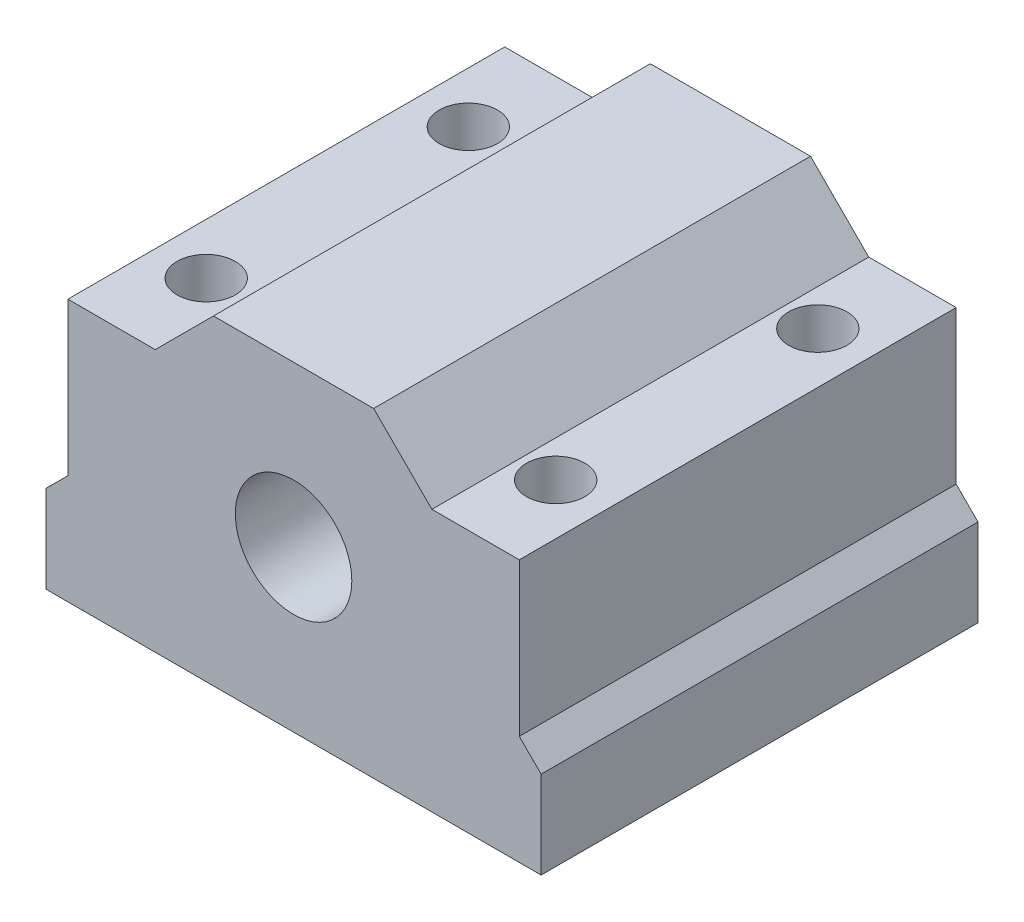
ISO-10303-21;
HEADER;
FILE_DESCRIPTION(('STEP AP214'),'2;1');
FILE_NAME('part.step','',(''),(''),'','','');
FILE_SCHEMA(('AUTOMOTIVE_DESIGN { 1 0 10303 214 1 1 1 1 }'));
ENDSEC;
DATA;
#1=APPLICATION_CONTEXT('core data for automotive mechanical design processes');
#2=APPLICATION_PROTOCOL_DEFINITION('international standard','automotive_design',2000,#1);
#3=PRODUCT_CONTEXT('',#1,'mechanical');
#4=PRODUCT('Part','Part','',(#3));
#5=PRODUCT_RELATED_PRODUCT_CATEGORY('part','',(#4));
#6=PRODUCT_DEFINITION_FORMATION('','',#4);
#7=PRODUCT_DEFINITION_CONTEXT('part definition',#1,'design');
#8=PRODUCT_DEFINITION('design','',#6,#7);
#9=PRODUCT_DEFINITION_SHAPE('','',#8);
#10=(LENGTH_UNIT() NAMED_UNIT(*) SI_UNIT(.MILLI.,.METRE.));
#11=(NAMED_UNIT(*) PLANE_ANGLE_UNIT() SI_UNIT($,.RADIAN.));
#12=(NAMED_UNIT(*) SI_UNIT($,.STERADIAN.) SOLID_ANGLE_UNIT());
#13=UNCERTAINTY_MEASURE_WITH_UNIT(LENGTH_MEASURE(1.E-05),#10,'distance_accuracy_value','');
#14=(GEOMETRIC_REPRESENTATION_CONTEXT(3) GLOBAL_UNCERTAINTY_ASSIGNED_CONTEXT((#13)) GLOBAL_UNIT_ASSIGNED_CONTEXT((#10,
#11,#12)) REPRESENTATION_CONTEXT('',''));
#15=CARTESIAN_POINT('',(0.,0.,0.));
#16=DIRECTION('',(0.,0.,1.));
#17=DIRECTION('',(1.,0.,0.));
#18=AXIS2_PLACEMENT_3D('',#15,#16,#17);
#19=CARTESIAN_POINT('',(0.,0.,30.));
#20=DIRECTION('',(0.,0.,-1.));
#21=DIRECTION('',(-1.,0.,0.));
#22=AXIS2_PLACEMENT_3D('',#19,#20,#21);
#23=PLANE('',#22);
#24=DIRECTION('',(0.,-1.,0.));
#25=VECTOR('',#24,1.);
#26=CARTESIAN_POINT('',(-17.,0.,30.));
#27=LINE('',#26,#25);
#28=CARTESIAN_POINT('',(-17.,6.,30.));
#29=VERTEX_POINT('',#28);
#30=CARTESIAN_POINT('',(-17.,0.,30.));
#31=VERTEX_POINT('',#30);
#32=EDGE_CURVE('E182',#29,#31,#27,.T.);
#33=ORIENTED_EDGE('',*,*,#32,.T.);
#34=DIRECTION('',(1.,0.,0.));
#35=VECTOR('',#34,1.);
#36=CARTESIAN_POINT('',(17.,0.,30.));
#37=LINE('',#36,#35);
#38=CARTESIAN_POINT('',(17.,0.,30.));
#39=VERTEX_POINT('',#38);
#40=EDGE_CURVE('E110',#31,#39,#37,.T.);
#41=ORIENTED_EDGE('',*,*,#40,.T.);
#42=DIRECTION('',(0.,1.,0.));
#43=VECTOR('',#42,1.);
#44=CARTESIAN_POINT('',(17.,0.,30.));
#45=LINE('',#44,#43);
#46=CARTESIAN_POINT('',(17.,6.,30.));
#47=VERTEX_POINT('',#46);
#48=EDGE_CURVE('E230',#39,#47,#45,.T.);
#49=ORIENTED_EDGE('',*,*,#48,.T.);
#50=DIRECTION('',(-0.707106781186545,0.70710678118655,0.));
#51=VECTOR('',#50,1.);
#52=CARTESIAN_POINT('',(17.,6.,30.));
#53=LINE('',#52,#51);
#54=CARTESIAN_POINT('',(15.5,7.50000000000001,30.));
#55=VERTEX_POINT('',#54);
#56=EDGE_CURVE('E232',#47,#55,#53,.T.);
#57=ORIENTED_EDGE('',*,*,#56,.T.);
#58=DIRECTION('',(0.,1.,0.));
#59=VECTOR('',#58,1.);
#60=CARTESIAN_POINT('',(15.5,7.50000000000001,30.));
#61=LINE('',#60,#59);
#62=CARTESIAN_POINT('',(15.5,18.,30.));
#63=VERTEX_POINT('',#62);
#64=EDGE_CURVE('E234',#55,#63,#61,.T.);
#65=ORIENTED_EDGE('',*,*,#64,.T.);
#66=DIRECTION('',(-1.,0.,0.));
#67=VECTOR('',#66,1.);
#68=CARTESIAN_POINT('',(15.5,18.,30.));
#69=LINE('',#68,#67);
#70=CARTESIAN_POINT('',(9.49999999999999,18.,30.));
#71=VERTEX_POINT('',#70);
#72=EDGE_CURVE('E236',#63,#71,#69,.T.);
#73=ORIENTED_EDGE('',*,*,#72,.T.);
#74=DIRECTION('',(-0.707106781186546,0.707106781186549,0.));
#75=VECTOR('',#74,1.);
#76=CARTESIAN_POINT('',(9.49999999999999,18.,30.));
#77=LINE('',#76,#75);
#78=CARTESIAN_POINT('',(5.5,22.,30.));
#79=VERTEX_POINT('',#78);
#80=EDGE_CURVE('E238',#71,#79,#77,.T.);
#81=ORIENTED_EDGE('',*,*,#80,.T.);
#82=DIRECTION('',(-1.,0.,0.));
#83=VECTOR('',#82,1.);
#84=CARTESIAN_POINT('',(-5.5,22.,30.));
#85=LINE('',#84,#83);
#86=CARTESIAN_POINT('',(-5.5,22.,30.));
#87=VERTEX_POINT('',#86);
#88=EDGE_CURVE('E240',#79,#87,#85,.T.);
#89=ORIENTED_EDGE('',*,*,#88,.T.);
#90=DIRECTION('',(-0.707106781186546,-0.707106781186549,0.));
#91=VECTOR('',#90,1.);
#92=CARTESIAN_POINT('',(-9.49999999999999,18.,30.));
#93=LINE('',#92,#91);
#94=CARTESIAN_POINT('',(-9.49999999999999,18.,30.));
#95=VERTEX_POINT('',#94);
#96=EDGE_CURVE('E141',#87,#95,#93,.T.);
#97=ORIENTED_EDGE('',*,*,#96,.T.);
#98=DIRECTION('',(-1.,0.,0.));
#99=VECTOR('',#98,1.);
#100=CARTESIAN_POINT('',(-15.5,18.,30.));
#101=LINE('',#100,#99);
#102=CARTESIAN_POINT('',(-15.5,18.,30.));
#103=VERTEX_POINT('',#102);
#104=EDGE_CURVE('E135',#95,#103,#101,.T.);
#105=ORIENTED_EDGE('',*,*,#104,.T.);
#106=DIRECTION('',(0.,-1.,0.));
#107=VECTOR('',#106,1.);
#108=CARTESIAN_POINT('',(-15.5,7.5,30.));
#109=LINE('',#108,#107);
#110=CARTESIAN_POINT('',(-15.5,7.5,30.));
#111=VERTEX_POINT('',#110);
#112=EDGE_CURVE('E139',#103,#111,#109,.T.);
#113=ORIENTED_EDGE('',*,*,#112,.T.);
#114=DIRECTION('',(-0.707106781186546,-0.707106781186549,0.));
#115=VECTOR('',#114,1.);
#116=CARTESIAN_POINT('',(-17.,6.,30.));
#117=LINE('',#116,#115);
#118=EDGE_CURVE('E55',#111,#29,#117,.T.);
#119=ORIENTED_EDGE('',*,*,#118,.T.);
#120=EDGE_LOOP('',(#33,#41,#49,#57,#65,#73,#81,#89,#97,#105,#113,#119));
#121=FACE_BOUND('',#120,.T.);
#122=CARTESIAN_POINT('',(0.,11.,30.));
#123=DIRECTION('',(0.,0.,1.));
#124=DIRECTION('',(1.,0.,0.));
#125=AXIS2_PLACEMENT_3D('',#122,#123,#124);
#126=CIRCLE('',#125,4.);
#127=CARTESIAN_POINT('',(4.,11.,30.));
#128=VERTEX_POINT('',#127);
#129=EDGE_CURVE('E163',#128,#128,#126,.T.);
#130=ORIENTED_EDGE('',*,*,#129,.F.);
#131=EDGE_LOOP('',(#130));
#132=FACE_BOUND('',#131,.T.);
#133=ADVANCED_FACE('F36',(#121,#132),#23,.F.);
#134=CARTESIAN_POINT('',(0.,0.,0.));
#135=DIRECTION('',(0.,0.,-1.));
#136=DIRECTION('',(-1.,0.,0.));
#137=AXIS2_PLACEMENT_3D('',#134,#135,#136);
#138=PLANE('',#137);
#139=DIRECTION('',(0.,-1.,0.));
#140=VECTOR('',#139,1.);
#141=CARTESIAN_POINT('',(-17.,0.,0.));
#142=LINE('',#141,#140);
#143=CARTESIAN_POINT('',(-17.,6.,0.));
#144=VERTEX_POINT('',#143);
#145=CARTESIAN_POINT('',(-17.,0.,0.));
#146=VERTEX_POINT('',#145);
#147=EDGE_CURVE('E159',#144,#146,#142,.T.);
#148=ORIENTED_EDGE('',*,*,#147,.F.);
#149=DIRECTION('',(-0.707106781186546,-0.707106781186549,0.));
#150=VECTOR('',#149,1.);
#151=CARTESIAN_POINT('',(-17.,6.,0.));
#152=LINE('',#151,#150);
#153=CARTESIAN_POINT('',(-15.5,7.5,0.));
#154=VERTEX_POINT('',#153);
#155=EDGE_CURVE('E102',#154,#144,#152,.T.);
#156=ORIENTED_EDGE('',*,*,#155,.F.);
#157=DIRECTION('',(0.,-1.,0.));
#158=VECTOR('',#157,1.);
#159=CARTESIAN_POINT('',(-15.5,7.5,0.));
#160=LINE('',#159,#158);
#161=CARTESIAN_POINT('',(-15.5,18.,0.));
#162=VERTEX_POINT('',#161);
#163=EDGE_CURVE('E96',#162,#154,#160,.T.);
#164=ORIENTED_EDGE('',*,*,#163,.F.);
#165=DIRECTION('',(-1.,0.,0.));
#166=VECTOR('',#165,1.);
#167=CARTESIAN_POINT('',(-15.5,18.,0.));
#168=LINE('',#167,#166);
#169=CARTESIAN_POINT('',(-9.49999999999999,18.,0.));
#170=VERTEX_POINT('',#169);
#171=EDGE_CURVE('E149',#170,#162,#168,.T.);
#172=ORIENTED_EDGE('',*,*,#171,.F.);
#173=DIRECTION('',(-0.707106781186546,-0.707106781186549,0.));
#174=VECTOR('',#173,1.);
#175=CARTESIAN_POINT('',(-9.49999999999999,18.,0.));
#176=LINE('',#175,#174);
#177=CARTESIAN_POINT('',(-5.5,22.,0.));
#178=VERTEX_POINT('',#177);
#179=EDGE_CURVE('E177',#178,#170,#176,.T.);
#180=ORIENTED_EDGE('',*,*,#179,.F.);
#181=DIRECTION('',(-1.,0.,0.));
#182=VECTOR('',#181,1.);
#183=CARTESIAN_POINT('',(-5.5,22.,0.));
#184=LINE('',#183,#182);
#185=CARTESIAN_POINT('',(5.5,22.,0.));
#186=VERTEX_POINT('',#185);
#187=EDGE_CURVE('E175',#186,#178,#184,.T.);
#188=ORIENTED_EDGE('',*,*,#187,.F.);
#189=DIRECTION('',(-0.707106781186546,0.707106781186549,0.));
#190=VECTOR('',#189,1.);
#191=CARTESIAN_POINT('',(9.49999999999999,18.,0.));
#192=LINE('',#191,#190);
#193=CARTESIAN_POINT('',(9.49999999999999,18.,0.));
#194=VERTEX_POINT('',#193);
#195=EDGE_CURVE('E173',#194,#186,#192,.T.);
#196=ORIENTED_EDGE('',*,*,#195,.F.);
#197=DIRECTION('',(-1.,0.,0.));
#198=VECTOR('',#197,1.);
#199=CARTESIAN_POINT('',(15.5,18.,0.));
#200=LINE('',#199,#198);
#201=CARTESIAN_POINT('',(15.5,18.,0.));
#202=VERTEX_POINT('',#201);
#203=EDGE_CURVE('E171',#202,#194,#200,.T.);
#204=ORIENTED_EDGE('',*,*,#203,.F.);
#205=DIRECTION('',(0.,1.,0.));
#206=VECTOR('',#205,1.);
#207=CARTESIAN_POINT('',(15.5,7.50000000000001,0.));
#208=LINE('',#207,#206);
#209=CARTESIAN_POINT('',(15.5,7.50000000000001,0.));
#210=VERTEX_POINT('',#209);
#211=EDGE_CURVE('E169',#210,#202,#208,.T.);
#212=ORIENTED_EDGE('',*,*,#211,.F.);
#213=DIRECTION('',(-0.707106781186545,0.70710678118655,0.));
#214=VECTOR('',#213,1.);
#215=CARTESIAN_POINT('',(17.,6.,0.));
#216=LINE('',#215,#214);
#217=CARTESIAN_POINT('',(17.,6.,0.));
#218=VERTEX_POINT('',#217);
#219=EDGE_CURVE('E167',#218,#210,#216,.T.);
#220=ORIENTED_EDGE('',*,*,#219,.F.);
#221=DIRECTION('',(0.,1.,0.));
#222=VECTOR('',#221,1.);
#223=CARTESIAN_POINT('',(17.,0.,0.));
#224=LINE('',#223,#222);
#225=CARTESIAN_POINT('',(17.,0.,0.));
#226=VERTEX_POINT('',#225);
#227=EDGE_CURVE('E165',#226,#218,#224,.T.);
#228=ORIENTED_EDGE('',*,*,#227,.F.);
#229=DIRECTION('',(1.,0.,0.));
#230=VECTOR('',#229,1.);
#231=CARTESIAN_POINT('',(17.,0.,0.));
#232=LINE('',#231,#230);
#233=EDGE_CURVE('E162',#146,#226,#232,.T.);
#234=ORIENTED_EDGE('',*,*,#233,.F.);
#235=EDGE_LOOP('',(#148,#156,#164,#172,#180,#188,#196,#204,#212,#220,#228,#234));
#236=FACE_BOUND('',#235,.T.);
#237=CARTESIAN_POINT('',(0.,11.,0.));
#238=DIRECTION('',(0.,0.,1.));
#239=DIRECTION('',(1.,0.,0.));
#240=AXIS2_PLACEMENT_3D('',#237,#238,#239);
#241=CIRCLE('',#240,4.);
#242=CARTESIAN_POINT('',(4.,11.,0.));
#243=VERTEX_POINT('',#242);
#244=EDGE_CURVE('E217',#243,#243,#241,.T.);
#245=ORIENTED_EDGE('',*,*,#244,.T.);
#246=EDGE_LOOP('',(#245));
#247=FACE_BOUND('',#246,.T.);
#248=ADVANCED_FACE('F253',(#236,#247),#138,.T.);
#249=CARTESIAN_POINT('',(-17.,0.,30.));
#250=DIRECTION('',(1.,0.,0.));
#251=DIRECTION('',(0.,0.,-1.));
#252=AXIS2_PLACEMENT_3D('',#249,#250,#251);
#253=PLANE('',#252);
#254=ORIENTED_EDGE('',*,*,#147,.T.);
#255=DIRECTION('',(0.,0.,-1.));
#256=VECTOR('',#255,1.);
#257=CARTESIAN_POINT('',(-17.,0.,30.));
#258=LINE('',#257,#256);
#259=EDGE_CURVE('E11',#31,#146,#258,.T.);
#260=ORIENTED_EDGE('',*,*,#259,.F.);
#261=ORIENTED_EDGE('',*,*,#32,.F.);
#262=DIRECTION('',(0.,0.,-1.));
#263=VECTOR('',#262,1.);
#264=CARTESIAN_POINT('',(-17.,6.,30.));
#265=LINE('',#264,#263);
#266=EDGE_CURVE('E155',#29,#144,#265,.T.);
#267=ORIENTED_EDGE('',*,*,#266,.T.);
#268=EDGE_LOOP('',(#254,#260,#261,#267));
#269=FACE_BOUND('',#268,.T.);
#270=ADVANCED_FACE('F38',(#269),#253,.F.);
#271=CARTESIAN_POINT('',(17.,0.,30.));
#272=DIRECTION('',(0.,1.,0.));
#273=DIRECTION('',(0.,0.,1.));
#274=AXIS2_PLACEMENT_3D('',#271,#272,#273);
#275=PLANE('',#274);
#276=CARTESIAN_POINT('',(12.,0.,6.));
#277=DIRECTION('',(0.,-1.,0.));
#278=DIRECTION('',(0.,0.,1.));
#279=AXIS2_PLACEMENT_3D('',#276,#277,#278);
#280=CIRCLE('',#279,2.);
#281=CARTESIAN_POINT('',(12.,0.,8.));
#282=VERTEX_POINT('',#281);
#283=EDGE_CURVE('E336',#282,#282,#280,.T.);
#284=ORIENTED_EDGE('',*,*,#283,.F.);
#285=EDGE_LOOP('',(#284));
#286=FACE_BOUND('',#285,.T.);
#287=CARTESIAN_POINT('',(-12.,0.,6.00000000000001));
#288=DIRECTION('',(0.,-1.,0.));
#289=DIRECTION('',(0.,0.,-1.));
#290=AXIS2_PLACEMENT_3D('',#287,#288,#289);
#291=CIRCLE('',#290,2.);
#292=CARTESIAN_POINT('',(-12.,0.,4.00000000000001));
#293=VERTEX_POINT('',#292);
#294=EDGE_CURVE('E340',#293,#293,#291,.T.);
#295=ORIENTED_EDGE('',*,*,#294,.F.);
#296=EDGE_LOOP('',(#295));
#297=FACE_BOUND('',#296,.T.);
#298=CARTESIAN_POINT('',(-12.,0.,24.));
#299=DIRECTION('',(0.,-1.,0.));
#300=DIRECTION('',(0.,0.,1.));
#301=AXIS2_PLACEMENT_3D('',#298,#299,#300);
#302=CIRCLE('',#301,2.);
#303=CARTESIAN_POINT('',(-12.,0.,26.));
#304=VERTEX_POINT('',#303);
#305=EDGE_CURVE('E296',#304,#304,#302,.T.);
#306=ORIENTED_EDGE('',*,*,#305,.F.);
#307=EDGE_LOOP('',(#306));
#308=FACE_BOUND('',#307,.T.);
#309=CARTESIAN_POINT('',(12.,0.,24.));
#310=DIRECTION('',(0.,-1.,0.));
#311=DIRECTION('',(0.,0.,-1.));
#312=AXIS2_PLACEMENT_3D('',#309,#310,#311);
#313=CIRCLE('',#312,2.);
#314=CARTESIAN_POINT('',(12.,0.,22.));
#315=VERTEX_POINT('',#314);
#316=EDGE_CURVE('E210',#315,#315,#313,.T.);
#317=ORIENTED_EDGE('',*,*,#316,.F.);
#318=EDGE_LOOP('',(#317));
#319=FACE_BOUND('',#318,.T.);
#320=ORIENTED_EDGE('',*,*,#233,.T.);
#321=DIRECTION('',(0.,0.,-1.));
#322=VECTOR('',#321,1.);
#323=CARTESIAN_POINT('',(17.,0.,30.));
#324=LINE('',#323,#322);
#325=EDGE_CURVE('E46',#39,#226,#324,.T.);
#326=ORIENTED_EDGE('',*,*,#325,.F.);
#327=ORIENTED_EDGE('',*,*,#40,.F.);
#328=ORIENTED_EDGE('',*,*,#259,.T.);
#329=EDGE_LOOP('',(#320,#326,#327,#328));
#330=FACE_BOUND('',#329,.T.);
#331=ADVANCED_FACE('F326',(#286,#297,#308,#319,#330),#275,.F.);
#332=CARTESIAN_POINT('',(17.,0.,30.));
#333=DIRECTION('',(-1.,0.,0.));
#334=DIRECTION('',(0.,0.,1.));
#335=AXIS2_PLACEMENT_3D('',#332,#333,#334);
#336=PLANE('',#335);
#337=ORIENTED_EDGE('',*,*,#227,.T.);
#338=DIRECTION('',(0.,0.,-1.));
#339=VECTOR('',#338,1.);
#340=CARTESIAN_POINT('',(17.,6.,30.));
#341=LINE('',#340,#339);
#342=EDGE_CURVE('E201',#47,#218,#341,.T.);
#343=ORIENTED_EDGE('',*,*,#342,.F.);
#344=ORIENTED_EDGE('',*,*,#48,.F.);
#345=ORIENTED_EDGE('',*,*,#325,.T.);
#346=EDGE_LOOP('',(#337,#343,#344,#345));
#347=FACE_BOUND('',#346,.T.);
#348=ADVANCED_FACE('F323',(#347),#336,.F.);
#349=CARTESIAN_POINT('',(17.,6.,30.));
#350=DIRECTION('',(-0.70710678118655,-0.707106781186546,0.));
#351=DIRECTION('',(0.707106781186546,-0.70710678118655,0.));
#352=AXIS2_PLACEMENT_3D('',#349,#350,#351);
#353=PLANE('',#352);
#354=ORIENTED_EDGE('',*,*,#219,.T.);
#355=DIRECTION('',(0.,0.,-1.));
#356=VECTOR('',#355,1.);
#357=CARTESIAN_POINT('',(15.5,7.50000000000001,30.));
#358=LINE('',#357,#356);
#359=EDGE_CURVE('E198',#55,#210,#358,.T.);
#360=ORIENTED_EDGE('',*,*,#359,.F.);
#361=ORIENTED_EDGE('',*,*,#56,.F.);
#362=ORIENTED_EDGE('',*,*,#342,.T.);
#363=EDGE_LOOP('',(#354,#360,#361,#362));
#364=FACE_BOUND('',#363,.T.);
#365=ADVANCED_FACE('F319',(#364),#353,.F.);
#366=CARTESIAN_POINT('',(15.5,7.50000000000001,30.));
#367=DIRECTION('',(-1.,0.,0.));
#368=DIRECTION('',(0.,0.,1.));
#369=AXIS2_PLACEMENT_3D('',#366,#367,#368);
#370=PLANE('',#369);
#371=ORIENTED_EDGE('',*,*,#211,.T.);
#372=DIRECTION('',(0.,0.,-1.));
#373=VECTOR('',#372,1.);
#374=CARTESIAN_POINT('',(15.5,18.,30.));
#375=LINE('',#374,#373);
#376=EDGE_CURVE('E195',#63,#202,#375,.T.);
#377=ORIENTED_EDGE('',*,*,#376,.F.);
#378=ORIENTED_EDGE('',*,*,#64,.F.);
#379=ORIENTED_EDGE('',*,*,#359,.T.);
#380=EDGE_LOOP('',(#371,#377,#378,#379));
#381=FACE_BOUND('',#380,.T.);
#382=ADVANCED_FACE('F316',(#381),#370,.F.);
#383=CARTESIAN_POINT('',(15.5,18.,30.));
#384=DIRECTION('',(0.,-1.,0.));
#385=DIRECTION('',(0.,0.,-1.));
#386=AXIS2_PLACEMENT_3D('',#383,#384,#385);
#387=PLANE('',#386);
#388=CARTESIAN_POINT('',(12.,18.,6.));
#389=DIRECTION('',(0.,-1.,0.));
#390=DIRECTION('',(0.,0.,-1.));
#391=AXIS2_PLACEMENT_3D('',#388,#389,#390);
#392=CIRCLE('',#391,2.);
#393=CARTESIAN_POINT('',(12.,18.,4.));
#394=VERTEX_POINT('',#393);
#395=EDGE_CURVE('E40',#394,#394,#392,.T.);
#396=ORIENTED_EDGE('',*,*,#395,.T.);
#397=EDGE_LOOP('',(#396));
#398=FACE_BOUND('',#397,.T.);
#399=CARTESIAN_POINT('',(12.,18.,24.));
#400=DIRECTION('',(0.,-1.,0.));
#401=DIRECTION('',(0.,0.,-1.));
#402=AXIS2_PLACEMENT_3D('',#399,#400,#401);
#403=CIRCLE('',#402,2.);
#404=CARTESIAN_POINT('',(12.,18.,22.));
#405=VERTEX_POINT('',#404);
#406=EDGE_CURVE('E212',#405,#405,#403,.T.);
#407=ORIENTED_EDGE('',*,*,#406,.T.);
#408=EDGE_LOOP('',(#407));
#409=FACE_BOUND('',#408,.T.);
#410=ORIENTED_EDGE('',*,*,#203,.T.);
#411=DIRECTION('',(0.,0.,-1.));
#412=VECTOR('',#411,1.);
#413=CARTESIAN_POINT('',(9.49999999999999,18.,30.));
#414=LINE('',#413,#412);
#415=EDGE_CURVE('E192',#71,#194,#414,.T.);
#416=ORIENTED_EDGE('',*,*,#415,.F.);
#417=ORIENTED_EDGE('',*,*,#72,.F.);
#418=ORIENTED_EDGE('',*,*,#376,.T.);
#419=EDGE_LOOP('',(#410,#416,#417,#418));
#420=FACE_BOUND('',#419,.T.);
#421=ADVANCED_FACE('F312',(#398,#409,#420),#387,.F.);
#422=CARTESIAN_POINT('',(9.49999999999999,18.,30.));
#423=DIRECTION('',(-0.707106781186549,-0.707106781186546,0.));
#424=DIRECTION('',(0.707106781186546,-0.707106781186549,0.));
#425=AXIS2_PLACEMENT_3D('',#422,#423,#424);
#426=PLANE('',#425);
#427=ORIENTED_EDGE('',*,*,#195,.T.);
#428=DIRECTION('',(0.,0.,-1.));
#429=VECTOR('',#428,1.);
#430=CARTESIAN_POINT('',(5.5,22.,30.));
#431=LINE('',#430,#429);
#432=EDGE_CURVE('E189',#79,#186,#431,.T.);
#433=ORIENTED_EDGE('',*,*,#432,.F.);
#434=ORIENTED_EDGE('',*,*,#80,.F.);
#435=ORIENTED_EDGE('',*,*,#415,.T.);
#436=EDGE_LOOP('',(#427,#433,#434,#435));
#437=FACE_BOUND('',#436,.T.);
#438=ADVANCED_FACE('F309',(#437),#426,.F.);
#439=CARTESIAN_POINT('',(-5.5,22.,30.));
#440=DIRECTION('',(0.,-1.,0.));
#441=DIRECTION('',(1.,0.,0.));
#442=AXIS2_PLACEMENT_3D('',#439,#440,#441);
#443=PLANE('',#442);
#444=ORIENTED_EDGE('',*,*,#187,.T.);
#445=DIRECTION('',(0.,0.,-1.));
#446=VECTOR('',#445,1.);
#447=CARTESIAN_POINT('',(-5.5,22.,30.));
#448=LINE('',#447,#446);
#449=EDGE_CURVE('E186',#87,#178,#448,.T.);
#450=ORIENTED_EDGE('',*,*,#449,.F.);
#451=ORIENTED_EDGE('',*,*,#88,.F.);
#452=ORIENTED_EDGE('',*,*,#432,.T.);
#453=EDGE_LOOP('',(#444,#450,#451,#452));
#454=FACE_BOUND('',#453,.T.);
#455=ADVANCED_FACE('F246',(#454),#443,.F.);
#456=CARTESIAN_POINT('',(-9.49999999999999,18.,30.));
#457=DIRECTION('',(0.707106781186549,-0.707106781186546,0.));
#458=DIRECTION('',(0.707106781186546,0.707106781186549,0.));
#459=AXIS2_PLACEMENT_3D('',#456,#457,#458);
#460=PLANE('',#459);
#461=ORIENTED_EDGE('',*,*,#179,.T.);
#462=DIRECTION('',(0.,0.,-1.));
#463=VECTOR('',#462,1.);
#464=CARTESIAN_POINT('',(-9.49999999999999,18.,30.));
#465=LINE('',#464,#463);
#466=EDGE_CURVE('E150',#95,#170,#465,.T.);
#467=ORIENTED_EDGE('',*,*,#466,.F.);
#468=ORIENTED_EDGE('',*,*,#96,.F.);
#469=ORIENTED_EDGE('',*,*,#449,.T.);
#470=EDGE_LOOP('',(#461,#467,#468,#469));
#471=FACE_BOUND('',#470,.T.);
#472=ADVANCED_FACE('F250',(#471),#460,.F.);
#473=CARTESIAN_POINT('',(-15.5,18.,30.));
#474=DIRECTION('',(0.,-1.,0.));
#475=DIRECTION('',(0.,0.,-1.));
#476=AXIS2_PLACEMENT_3D('',#473,#474,#475);
#477=PLANE('',#476);
#478=CARTESIAN_POINT('',(-12.,18.,6.00000000000001));
#479=DIRECTION('',(0.,-1.,0.));
#480=DIRECTION('',(0.,0.,-1.));
#481=AXIS2_PLACEMENT_3D('',#478,#479,#480);
#482=CIRCLE('',#481,2.);
#483=CARTESIAN_POINT('',(-12.,18.,4.00000000000001));
#484=VERTEX_POINT('',#483);
#485=EDGE_CURVE('E209',#484,#484,#482,.T.);
#486=ORIENTED_EDGE('',*,*,#485,.T.);
#487=EDGE_LOOP('',(#486));
#488=FACE_BOUND('',#487,.T.);
#489=CARTESIAN_POINT('',(-12.,18.,24.));
#490=DIRECTION('',(0.,-1.,0.));
#491=DIRECTION('',(0.,0.,-1.));
#492=AXIS2_PLACEMENT_3D('',#489,#490,#491);
#493=CIRCLE('',#492,2.);
#494=CARTESIAN_POINT('',(-12.,18.,22.));
#495=VERTEX_POINT('',#494);
#496=EDGE_CURVE('E206',#495,#495,#493,.T.);
#497=ORIENTED_EDGE('',*,*,#496,.T.);
#498=EDGE_LOOP('',(#497));
#499=FACE_BOUND('',#498,.T.);
#500=ORIENTED_EDGE('',*,*,#171,.T.);
#501=DIRECTION('',(0.,0.,-1.));
#502=VECTOR('',#501,1.);
#503=CARTESIAN_POINT('',(-15.5,18.,30.));
#504=LINE('',#503,#502);
#505=EDGE_CURVE('E146',#103,#162,#504,.T.);
#506=ORIENTED_EDGE('',*,*,#505,.F.);
#507=ORIENTED_EDGE('',*,*,#104,.F.);
#508=ORIENTED_EDGE('',*,*,#466,.T.);
#509=EDGE_LOOP('',(#500,#506,#507,#508));
#510=FACE_BOUND('',#509,.T.);
#511=ADVANCED_FACE('F147',(#488,#499,#510),#477,.F.);
#512=CARTESIAN_POINT('',(-15.5,7.5,30.));
#513=DIRECTION('',(1.,0.,0.));
#514=DIRECTION('',(0.,0.,-1.));
#515=AXIS2_PLACEMENT_3D('',#512,#513,#514);
#516=PLANE('',#515);
#517=ORIENTED_EDGE('',*,*,#163,.T.);
#518=DIRECTION('',(0.,0.,-1.));
#519=VECTOR('',#518,1.);
#520=CARTESIAN_POINT('',(-15.5,7.5,30.));
#521=LINE('',#520,#519);
#522=EDGE_CURVE('E151',#111,#154,#521,.T.);
#523=ORIENTED_EDGE('',*,*,#522,.F.);
#524=ORIENTED_EDGE('',*,*,#112,.F.);
#525=ORIENTED_EDGE('',*,*,#505,.T.);
#526=EDGE_LOOP('',(#517,#523,#524,#525));
#527=FACE_BOUND('',#526,.T.);
#528=ADVANCED_FACE('F153',(#527),#516,.F.);
#529=CARTESIAN_POINT('',(-17.,6.,30.));
#530=DIRECTION('',(0.707106781186549,-0.707106781186546,0.));
#531=DIRECTION('',(0.707106781186546,0.707106781186549,0.));
#532=AXIS2_PLACEMENT_3D('',#529,#530,#531);
#533=PLANE('',#532);
#534=ORIENTED_EDGE('',*,*,#155,.T.);
#535=ORIENTED_EDGE('',*,*,#266,.F.);
#536=ORIENTED_EDGE('',*,*,#118,.F.);
#537=ORIENTED_EDGE('',*,*,#522,.T.);
#538=EDGE_LOOP('',(#534,#535,#536,#537));
#539=FACE_BOUND('',#538,.T.);
#540=ADVANCED_FACE('F258',(#539),#533,.F.);
#541=CARTESIAN_POINT('',(0.,11.,30.));
#542=DIRECTION('',(0.,0.,-1.));
#543=DIRECTION('',(-1.,0.,0.));
#544=AXIS2_PLACEMENT_3D('',#541,#542,#543);
#545=CYLINDRICAL_SURFACE('',#544,4.);
#546=ORIENTED_EDGE('',*,*,#129,.T.);
#547=EDGE_LOOP('',(#546));
#548=FACE_BOUND('',#547,.T.);
#549=ORIENTED_EDGE('',*,*,#244,.F.);
#550=EDGE_LOOP('',(#549));
#551=FACE_BOUND('',#550,.T.);
#552=ADVANCED_FACE('F260',(#548,#551),#545,.F.);
#553=CARTESIAN_POINT('',(-12.,22.,24.));
#554=DIRECTION('',(0.,-1.,0.));
#555=DIRECTION('',(0.,0.,-1.));
#556=AXIS2_PLACEMENT_3D('',#553,#554,#555);
#557=CYLINDRICAL_SURFACE('',#556,2.);
#558=ORIENTED_EDGE('',*,*,#305,.T.);
#559=EDGE_LOOP('',(#558));
#560=FACE_BOUND('',#559,.T.);
#561=ORIENTED_EDGE('',*,*,#496,.F.);
#562=EDGE_LOOP('',(#561));
#563=FACE_BOUND('',#562,.T.);
#564=ADVANCED_FACE('F266',(#560,#563),#557,.F.);
#565=CARTESIAN_POINT('',(-12.,22.,6.00000000000001));
#566=DIRECTION('',(0.,-1.,0.));
#567=DIRECTION('',(0.,0.,-1.));
#568=AXIS2_PLACEMENT_3D('',#565,#566,#567);
#569=CYLINDRICAL_SURFACE('',#568,2.);
#570=ORIENTED_EDGE('',*,*,#294,.T.);
#571=EDGE_LOOP('',(#570));
#572=FACE_BOUND('',#571,.T.);
#573=ORIENTED_EDGE('',*,*,#485,.F.);
#574=EDGE_LOOP('',(#573));
#575=FACE_BOUND('',#574,.T.);
#576=ADVANCED_FACE('F281',(#572,#575),#569,.F.);
#577=CARTESIAN_POINT('',(12.,22.,24.));
#578=DIRECTION('',(0.,-1.,0.));
#579=DIRECTION('',(0.,0.,-1.));
#580=AXIS2_PLACEMENT_3D('',#577,#578,#579);
#581=CYLINDRICAL_SURFACE('',#580,2.);
#582=ORIENTED_EDGE('',*,*,#316,.T.);
#583=EDGE_LOOP('',(#582));
#584=FACE_BOUND('',#583,.T.);
#585=ORIENTED_EDGE('',*,*,#406,.F.);
#586=EDGE_LOOP('',(#585));
#587=FACE_BOUND('',#586,.T.);
#588=ADVANCED_FACE('F277',(#584,#587),#581,.F.);
#589=CARTESIAN_POINT('',(12.,22.,6.));
#590=DIRECTION('',(0.,-1.,0.));
#591=DIRECTION('',(0.,0.,-1.));
#592=AXIS2_PLACEMENT_3D('',#589,#590,#591);
#593=CYLINDRICAL_SURFACE('',#592,2.);
#594=ORIENTED_EDGE('',*,*,#283,.T.);
#595=EDGE_LOOP('',(#594));
#596=FACE_BOUND('',#595,.T.);
#597=ORIENTED_EDGE('',*,*,#395,.F.);
#598=EDGE_LOOP('',(#597));
#599=FACE_BOUND('',#598,.T.);
#600=ADVANCED_FACE('F280',(#596,#599),#593,.F.);
#601=CLOSED_SHELL('',(#133,#248,#270,#331,#348,#365,#382,#421,#438,#455,#472,#511,#528,#540,
#552,#564,#576,#588,#600));
#602=MANIFOLD_SOLID_BREP('B2',#601);
#603=ADVANCED_BREP_SHAPE_REPRESENTATION('',(#18,#602),#14);
#604=SHAPE_DEFINITION_REPRESENTATION(#9,#603);
ENDSEC;
END-ISO-10303-21;
